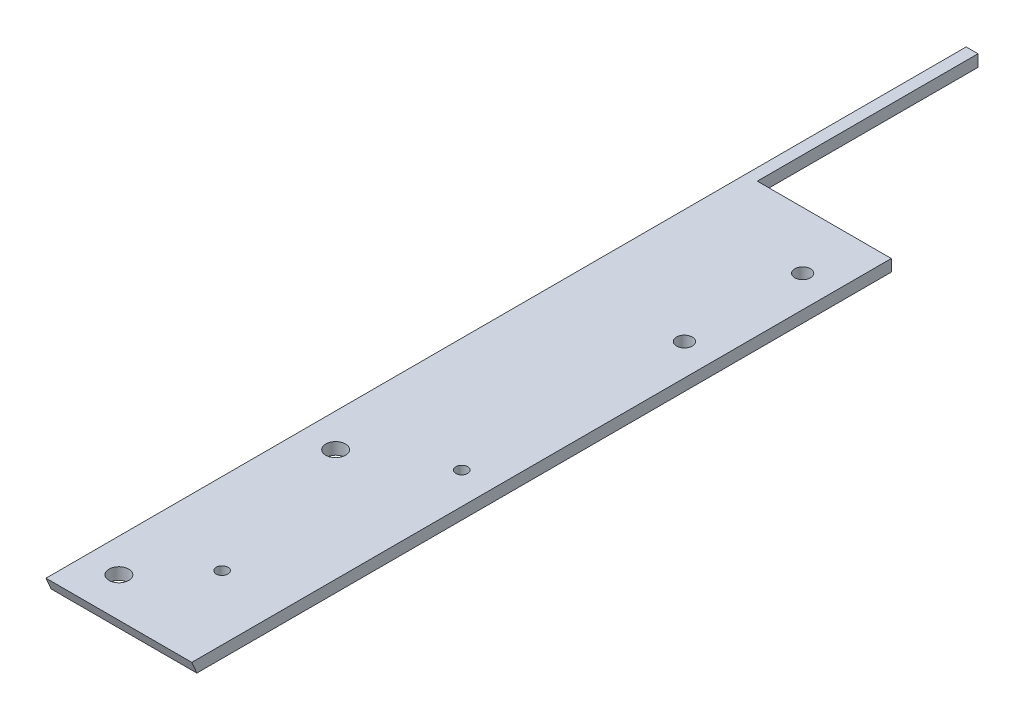
ISO-10303-21;
HEADER;
FILE_DESCRIPTION(('STEP AP214'),'2;1');
FILE_NAME('part.step','',(''),(''),'','','');
FILE_SCHEMA(('AUTOMOTIVE_DESIGN { 1 0 10303 214 1 1 1 1 }'));
ENDSEC;
DATA;
#1=APPLICATION_CONTEXT('core data for automotive mechanical design processes');
#2=APPLICATION_PROTOCOL_DEFINITION('international standard','automotive_design',2000,#1);
#3=PRODUCT_CONTEXT('',#1,'mechanical');
#4=PRODUCT('Part','Part','',(#3));
#5=PRODUCT_RELATED_PRODUCT_CATEGORY('part','',(#4));
#6=PRODUCT_DEFINITION_FORMATION('','',#4);
#7=PRODUCT_DEFINITION_CONTEXT('part definition',#1,'design');
#8=PRODUCT_DEFINITION('design','',#6,#7);
#9=PRODUCT_DEFINITION_SHAPE('','',#8);
#10=(LENGTH_UNIT() NAMED_UNIT(*) SI_UNIT(.MILLI.,.METRE.));
#11=(NAMED_UNIT(*) PLANE_ANGLE_UNIT() SI_UNIT($,.RADIAN.));
#12=(NAMED_UNIT(*) SI_UNIT($,.STERADIAN.) SOLID_ANGLE_UNIT());
#13=UNCERTAINTY_MEASURE_WITH_UNIT(LENGTH_MEASURE(1.E-05),#10,'distance_accuracy_value','');
#14=(GEOMETRIC_REPRESENTATION_CONTEXT(3) GLOBAL_UNCERTAINTY_ASSIGNED_CONTEXT((#13)) GLOBAL_UNIT_ASSIGNED_CONTEXT((#10,
#11,#12)) REPRESENTATION_CONTEXT('',''));
#15=CARTESIAN_POINT('',(0.,0.,0.));
#16=DIRECTION('',(0.,0.,1.));
#17=DIRECTION('',(1.,0.,0.));
#18=AXIS2_PLACEMENT_3D('',#15,#16,#17);
#19=CARTESIAN_POINT('',(0.,6.17328196598963,-150.));
#20=DIRECTION('',(0.,1.,0.));
#21=DIRECTION('',(0.,0.,1.));
#22=AXIS2_PLACEMENT_3D('',#19,#20,#21);
#23=PLANE('',#22);
#24=CARTESIAN_POINT('',(31.9999999999993,6.17328196598963,-25.5));
#25=DIRECTION('',(0.,1.,0.));
#26=DIRECTION('',(0.,0.,1.));
#27=AXIS2_PLACEMENT_3D('',#24,#25,#26);
#28=CIRCLE('',#27,2.);
#29=CARTESIAN_POINT('',(31.9999999999993,6.17328196598963,-23.5));
#30=VERTEX_POINT('',#29);
#31=EDGE_CURVE('E169',#30,#30,#28,.T.);
#32=ORIENTED_EDGE('',*,*,#31,.F.);
#33=EDGE_LOOP('',(#32));
#34=FACE_BOUND('',#33,.T.);
#35=CARTESIAN_POINT('',(31.9999999999991,6.17328196598962,61.0000000000002));
#36=DIRECTION('',(0.,1.,0.));
#37=DIRECTION('',(0.,0.,1.));
#38=AXIS2_PLACEMENT_3D('',#35,#36,#37);
#39=CIRCLE('',#38,1.5);
#40=CARTESIAN_POINT('',(31.9999999999991,6.17328196598962,62.5000000000002));
#41=VERTEX_POINT('',#40);
#42=EDGE_CURVE('E173',#41,#41,#39,.F.);
#43=ORIENTED_EDGE('',*,*,#42,.T.);
#44=EDGE_LOOP('',(#43));
#45=FACE_BOUND('',#44,.T.);
#46=CARTESIAN_POINT('',(23.6907337459031,6.17328196598963,113.5));
#47=DIRECTION('',(0.,1.,0.));
#48=DIRECTION('',(0.,0.,1.));
#49=AXIS2_PLACEMENT_3D('',#46,#47,#48);
#50=CIRCLE('',#49,1.5);
#51=CARTESIAN_POINT('',(23.6907337459031,6.17328196598963,115.));
#52=VERTEX_POINT('',#51);
#53=EDGE_CURVE('E163',#52,#52,#50,.T.);
#54=ORIENTED_EDGE('',*,*,#53,.F.);
#55=EDGE_LOOP('',(#54));
#56=FACE_BOUND('',#55,.T.);
#57=CARTESIAN_POINT('',(31.9999999999993,6.17328196598963,4.49999999999998));
#58=DIRECTION('',(0.,1.,0.));
#59=DIRECTION('',(0.,0.,1.));
#60=AXIS2_PLACEMENT_3D('',#57,#58,#59);
#61=CIRCLE('',#60,2.);
#62=CARTESIAN_POINT('',(31.9999999999993,6.17328196598963,6.49999999999998));
#63=VERTEX_POINT('',#62);
#64=EDGE_CURVE('E160',#63,#63,#61,.T.);
#65=ORIENTED_EDGE('',*,*,#64,.F.);
#66=EDGE_LOOP('',(#65));
#67=FACE_BOUND('',#66,.T.);
#68=CARTESIAN_POINT('',(11.5,6.17328196598963,72.5));
#69=DIRECTION('',(0.,1.,0.));
#70=DIRECTION('',(-1.,0.,0.));
#71=AXIS2_PLACEMENT_3D('',#68,#69,#70);
#72=CIRCLE('',#71,2.5);
#73=CARTESIAN_POINT('',(8.99999999999999,6.17328196598963,72.5));
#74=VERTEX_POINT('',#73);
#75=EDGE_CURVE('E211',#74,#74,#72,.T.);
#76=ORIENTED_EDGE('',*,*,#75,.F.);
#77=EDGE_LOOP('',(#76));
#78=FACE_BOUND('',#77,.T.);
#79=CARTESIAN_POINT('',(11.5,6.17328196598963,127.5));
#80=DIRECTION('',(0.,1.,0.));
#81=DIRECTION('',(-1.,0.,0.));
#82=AXIS2_PLACEMENT_3D('',#79,#80,#81);
#83=CIRCLE('',#82,2.5);
#84=CARTESIAN_POINT('',(9.,6.17328196598963,127.5));
#85=VERTEX_POINT('',#84);
#86=EDGE_CURVE('E208',#85,#85,#83,.T.);
#87=ORIENTED_EDGE('',*,*,#86,.F.);
#88=EDGE_LOOP('',(#87));
#89=FACE_BOUND('',#88,.T.);
#90=DIRECTION('',(1.,0.,0.));
#91=VECTOR('',#90,1.);
#92=CARTESIAN_POINT('',(0.,6.17328196598963,-96.));
#93=LINE('',#92,#91);
#94=CARTESIAN_POINT('',(3.,6.17328196598963,-96.));
#95=VERTEX_POINT('',#94);
#96=CARTESIAN_POINT('',(6.00000000000001,6.17328196598963,-96.));
#97=VERTEX_POINT('',#96);
#98=EDGE_CURVE('E115',#95,#97,#93,.T.);
#99=ORIENTED_EDGE('',*,*,#98,.F.);
#100=DIRECTION('',(0.,0.,-1.));
#101=VECTOR('',#100,1.);
#102=CARTESIAN_POINT('',(3.,6.17328196598963,144.162869871994));
#103=LINE('',#102,#101);
#104=CARTESIAN_POINT('',(3.,6.17328196598963,137.5));
#105=VERTEX_POINT('',#104);
#106=EDGE_CURVE('E73',#105,#95,#103,.T.);
#107=ORIENTED_EDGE('',*,*,#106,.F.);
#108=DIRECTION('',(-1.,0.,0.));
#109=VECTOR('',#108,1.);
#110=CARTESIAN_POINT('',(31.,6.17328196598963,137.5));
#111=LINE('',#110,#109);
#112=CARTESIAN_POINT('',(40.,6.17328196598963,137.5));
#113=VERTEX_POINT('',#112);
#114=EDGE_CURVE('E172',#113,#105,#111,.T.);
#115=ORIENTED_EDGE('',*,*,#114,.F.);
#116=DIRECTION('',(0.,0.,1.));
#117=VECTOR('',#116,1.);
#118=CARTESIAN_POINT('',(40.,6.17328196598963,-150.));
#119=LINE('',#118,#117);
#120=CARTESIAN_POINT('',(40.,6.17328196598963,-40.));
#121=VERTEX_POINT('',#120);
#122=EDGE_CURVE('E181',#121,#113,#119,.T.);
#123=ORIENTED_EDGE('',*,*,#122,.F.);
#124=DIRECTION('',(1.,0.,0.));
#125=VECTOR('',#124,1.);
#126=CARTESIAN_POINT('',(40.,6.17328196598963,-40.));
#127=LINE('',#126,#125);
#128=CARTESIAN_POINT('',(6.00000000000002,6.17328196598963,-40.));
#129=VERTEX_POINT('',#128);
#130=EDGE_CURVE('E146',#129,#121,#127,.T.);
#131=ORIENTED_EDGE('',*,*,#130,.F.);
#132=DIRECTION('',(0.,0.,1.));
#133=VECTOR('',#132,1.);
#134=CARTESIAN_POINT('',(6.00000000000001,6.17328196598963,-150.));
#135=LINE('',#134,#133);
#136=EDGE_CURVE('E145',#97,#129,#135,.T.);
#137=ORIENTED_EDGE('',*,*,#136,.F.);
#138=EDGE_LOOP('',(#99,#107,#115,#123,#131,#137));
#139=FACE_BOUND('',#138,.T.);
#140=ADVANCED_FACE('F69',(#34,#45,#56,#67,#78,#89,#139),#23,.T.);
#141=CARTESIAN_POINT('',(31.,6.17328196598963,137.5));
#142=DIRECTION('',(0.,0.391916943435059,-0.920000602960955));
#143=DIRECTION('',(0.,0.920000602960955,0.391916943435059));
#144=AXIS2_PLACEMENT_3D('',#141,#142,#143);
#145=PLANE('',#144);
#146=DIRECTION('',(0.,0.920000602960955,0.391916943435059));
#147=VECTOR('',#146,1.);
#148=CARTESIAN_POINT('',(3.,6.17328196598962,137.5));
#149=LINE('',#148,#147);
#150=CARTESIAN_POINT('',(3.,3.17328196598962,136.222010804644));
#151=VERTEX_POINT('',#150);
#152=EDGE_CURVE('E103',#151,#105,#149,.T.);
#153=ORIENTED_EDGE('',*,*,#152,.F.);
#154=DIRECTION('',(1.,0.,0.));
#155=VECTOR('',#154,1.);
#156=CARTESIAN_POINT('',(5.00000000000003,3.17328196598962,136.222010804644));
#157=LINE('',#156,#155);
#158=CARTESIAN_POINT('',(40.,3.17328196598962,136.222010804644));
#159=VERTEX_POINT('',#158);
#160=EDGE_CURVE('E170',#151,#159,#157,.T.);
#161=ORIENTED_EDGE('',*,*,#160,.T.);
#162=DIRECTION('',(0.,-0.920000602960956,-0.391916943435057));
#163=VECTOR('',#162,1.);
#164=CARTESIAN_POINT('',(40.,-105.95282860637,89.7346807237414));
#165=LINE('',#164,#163);
#166=EDGE_CURVE('E177',#113,#159,#165,.T.);
#167=ORIENTED_EDGE('',*,*,#166,.F.);
#168=ORIENTED_EDGE('',*,*,#114,.T.);
#169=EDGE_LOOP('',(#153,#161,#167,#168));
#170=FACE_BOUND('',#169,.T.);
#171=ADVANCED_FACE('F195',(#170),#145,.F.);
#172=CARTESIAN_POINT('',(5.00000000000002,3.17328196598962,-150.));
#173=DIRECTION('',(0.,-1.,0.));
#174=DIRECTION('',(1.,0.,0.));
#175=AXIS2_PLACEMENT_3D('',#172,#173,#174);
#176=PLANE('',#175);
#177=CARTESIAN_POINT('',(31.9999999999993,3.17328196598963,-25.5));
#178=DIRECTION('',(0.,-1.,0.));
#179=DIRECTION('',(1.,0.,0.));
#180=AXIS2_PLACEMENT_3D('',#177,#178,#179);
#181=CIRCLE('',#180,2.);
#182=CARTESIAN_POINT('',(33.9999999999994,3.17328196598963,-25.5));
#183=VERTEX_POINT('',#182);
#184=EDGE_CURVE('E186',#183,#183,#181,.T.);
#185=ORIENTED_EDGE('',*,*,#184,.F.);
#186=EDGE_LOOP('',(#185));
#187=FACE_BOUND('',#186,.T.);
#188=CARTESIAN_POINT('',(31.9999999999991,3.17328196598962,61.0000000000002));
#189=DIRECTION('',(0.,-1.,0.));
#190=DIRECTION('',(1.,0.,0.));
#191=AXIS2_PLACEMENT_3D('',#188,#189,#190);
#192=CIRCLE('',#191,1.5);
#193=CARTESIAN_POINT('',(33.4999999999991,3.17328196598962,61.0000000000002));
#194=VERTEX_POINT('',#193);
#195=EDGE_CURVE('E176',#194,#194,#192,.F.);
#196=ORIENTED_EDGE('',*,*,#195,.T.);
#197=EDGE_LOOP('',(#196));
#198=FACE_BOUND('',#197,.T.);
#199=DIRECTION('',(0.,0.,-1.));
#200=VECTOR('',#199,1.);
#201=CARTESIAN_POINT('',(40.,3.17328196598963,-150.));
#202=LINE('',#201,#200);
#203=CARTESIAN_POINT('',(40.,3.17328196598963,-40.));
#204=VERTEX_POINT('',#203);
#205=EDGE_CURVE('E180',#159,#204,#202,.T.);
#206=ORIENTED_EDGE('',*,*,#205,.F.);
#207=ORIENTED_EDGE('',*,*,#160,.F.);
#208=DIRECTION('',(0.,0.,1.));
#209=VECTOR('',#208,1.);
#210=CARTESIAN_POINT('',(3.,3.17328196598962,-150.));
#211=LINE('',#210,#209);
#212=CARTESIAN_POINT('',(3.,3.17328196598962,-96.));
#213=VERTEX_POINT('',#212);
#214=EDGE_CURVE('E12',#213,#151,#211,.T.);
#215=ORIENTED_EDGE('',*,*,#214,.F.);
#216=DIRECTION('',(-1.,0.,0.));
#217=VECTOR('',#216,1.);
#218=CARTESIAN_POINT('',(7.2,3.17328196598962,-96.));
#219=LINE('',#218,#217);
#220=CARTESIAN_POINT('',(6.00000000000001,3.17328196598962,-96.));
#221=VERTEX_POINT('',#220);
#222=EDGE_CURVE('E150',#221,#213,#219,.T.);
#223=ORIENTED_EDGE('',*,*,#222,.F.);
#224=DIRECTION('',(0.,0.,-1.));
#225=VECTOR('',#224,1.);
#226=CARTESIAN_POINT('',(6.00000000000001,3.17328196598962,-150.));
#227=LINE('',#226,#225);
#228=CARTESIAN_POINT('',(6.00000000000002,3.17328196598962,-40.));
#229=VERTEX_POINT('',#228);
#230=EDGE_CURVE('E143',#229,#221,#227,.T.);
#231=ORIENTED_EDGE('',*,*,#230,.F.);
#232=DIRECTION('',(-1.,0.,0.));
#233=VECTOR('',#232,1.);
#234=CARTESIAN_POINT('',(5.00000000000004,3.17328196598962,-40.));
#235=LINE('',#234,#233);
#236=EDGE_CURVE('E129',#204,#229,#235,.T.);
#237=ORIENTED_EDGE('',*,*,#236,.F.);
#238=EDGE_LOOP('',(#206,#207,#215,#223,#231,#237));
#239=FACE_BOUND('',#238,.T.);
#240=CARTESIAN_POINT('',(23.6907337459031,3.17328196598963,113.5));
#241=DIRECTION('',(0.,-1.,0.));
#242=DIRECTION('',(1.,0.,0.));
#243=AXIS2_PLACEMENT_3D('',#240,#241,#242);
#244=CIRCLE('',#243,1.5);
#245=CARTESIAN_POINT('',(25.1907337459031,3.17328196598963,113.5));
#246=VERTEX_POINT('',#245);
#247=EDGE_CURVE('E166',#246,#246,#244,.T.);
#248=ORIENTED_EDGE('',*,*,#247,.F.);
#249=EDGE_LOOP('',(#248));
#250=FACE_BOUND('',#249,.T.);
#251=CARTESIAN_POINT('',(31.9999999999993,3.17328196598962,4.49999999999998));
#252=DIRECTION('',(0.,-1.,0.));
#253=DIRECTION('',(1.,0.,0.));
#254=AXIS2_PLACEMENT_3D('',#251,#252,#253);
#255=CIRCLE('',#254,2.);
#256=CARTESIAN_POINT('',(33.9999999999994,3.17328196598962,4.49999999999998));
#257=VERTEX_POINT('',#256);
#258=EDGE_CURVE('E156',#257,#257,#255,.T.);
#259=ORIENTED_EDGE('',*,*,#258,.F.);
#260=EDGE_LOOP('',(#259));
#261=FACE_BOUND('',#260,.T.);
#262=CARTESIAN_POINT('',(11.5,3.17328196598963,72.5));
#263=DIRECTION('',(0.,1.,0.));
#264=DIRECTION('',(-1.,0.,0.));
#265=AXIS2_PLACEMENT_3D('',#262,#263,#264);
#266=CIRCLE('',#265,2.5);
#267=CARTESIAN_POINT('',(8.99999999999999,3.17328196598963,72.5));
#268=VERTEX_POINT('',#267);
#269=EDGE_CURVE('E199',#268,#268,#266,.T.);
#270=ORIENTED_EDGE('',*,*,#269,.T.);
#271=EDGE_LOOP('',(#270));
#272=FACE_BOUND('',#271,.T.);
#273=CARTESIAN_POINT('',(11.5,3.17328196598963,127.5));
#274=DIRECTION('',(0.,1.,0.));
#275=DIRECTION('',(-1.,0.,0.));
#276=AXIS2_PLACEMENT_3D('',#273,#274,#275);
#277=CIRCLE('',#276,2.5);
#278=CARTESIAN_POINT('',(9.,3.17328196598963,127.5));
#279=VERTEX_POINT('',#278);
#280=EDGE_CURVE('E202',#279,#279,#277,.T.);
#281=ORIENTED_EDGE('',*,*,#280,.T.);
#282=EDGE_LOOP('',(#281));
#283=FACE_BOUND('',#282,.T.);
#284=ADVANCED_FACE('F148',(#187,#198,#239,#250,#261,#272,#283),#176,.T.);
#285=CARTESIAN_POINT('',(11.5,3.17328196598963,127.5));
#286=DIRECTION('',(0.,1.,0.));
#287=DIRECTION('',(-1.,0.,0.));
#288=AXIS2_PLACEMENT_3D('',#285,#286,#287);
#289=CYLINDRICAL_SURFACE('',#288,2.5);
#290=ORIENTED_EDGE('',*,*,#280,.F.);
#291=EDGE_LOOP('',(#290));
#292=FACE_BOUND('',#291,.T.);
#293=ORIENTED_EDGE('',*,*,#86,.T.);
#294=EDGE_LOOP('',(#293));
#295=FACE_BOUND('',#294,.T.);
#296=ADVANCED_FACE('F194',(#292,#295),#289,.F.);
#297=CARTESIAN_POINT('',(11.5,3.17328196598963,72.5));
#298=DIRECTION('',(0.,1.,0.));
#299=DIRECTION('',(-1.,0.,0.));
#300=AXIS2_PLACEMENT_3D('',#297,#298,#299);
#301=CYLINDRICAL_SURFACE('',#300,2.5);
#302=ORIENTED_EDGE('',*,*,#269,.F.);
#303=EDGE_LOOP('',(#302));
#304=FACE_BOUND('',#303,.T.);
#305=ORIENTED_EDGE('',*,*,#75,.T.);
#306=EDGE_LOOP('',(#305));
#307=FACE_BOUND('',#306,.T.);
#308=ADVANCED_FACE('F255',(#304,#307),#301,.F.);
#309=CARTESIAN_POINT('',(40.,-3.82671803401037,-150.));
#310=DIRECTION('',(-1.,0.,0.));
#311=DIRECTION('',(0.,-1.,0.));
#312=AXIS2_PLACEMENT_3D('',#309,#310,#311);
#313=PLANE('',#312);
#314=ORIENTED_EDGE('',*,*,#122,.T.);
#315=ORIENTED_EDGE('',*,*,#166,.T.);
#316=ORIENTED_EDGE('',*,*,#205,.T.);
#317=DIRECTION('',(0.,1.,0.));
#318=VECTOR('',#317,1.);
#319=CARTESIAN_POINT('',(40.,-3.82671803401037,-40.));
#320=LINE('',#319,#318);
#321=EDGE_CURVE('E135',#204,#121,#320,.T.);
#322=ORIENTED_EDGE('',*,*,#321,.T.);
#323=EDGE_LOOP('',(#314,#315,#316,#322));
#324=FACE_BOUND('',#323,.T.);
#325=ADVANCED_FACE('F220',(#324),#313,.F.);
#326=CARTESIAN_POINT('',(40.,2.17328196598963,-40.));
#327=DIRECTION('',(0.,0.,1.));
#328=DIRECTION('',(1.,0.,0.));
#329=AXIS2_PLACEMENT_3D('',#326,#327,#328);
#330=PLANE('',#329);
#331=ORIENTED_EDGE('',*,*,#236,.T.);
#332=DIRECTION('',(0.,1.,0.));
#333=VECTOR('',#332,1.);
#334=CARTESIAN_POINT('',(6.00000000000002,2.17328196598963,-40.));
#335=LINE('',#334,#333);
#336=EDGE_CURVE('E132',#229,#129,#335,.T.);
#337=ORIENTED_EDGE('',*,*,#336,.T.);
#338=ORIENTED_EDGE('',*,*,#130,.T.);
#339=ORIENTED_EDGE('',*,*,#321,.F.);
#340=EDGE_LOOP('',(#331,#337,#338,#339));
#341=FACE_BOUND('',#340,.T.);
#342=ADVANCED_FACE('F131',(#341),#330,.F.);
#343=CARTESIAN_POINT('',(6.00000000000001,2.17328196598963,-150.));
#344=DIRECTION('',(-1.,0.,0.));
#345=DIRECTION('',(0.,-1.,0.));
#346=AXIS2_PLACEMENT_3D('',#343,#344,#345);
#347=PLANE('',#346);
#348=ORIENTED_EDGE('',*,*,#230,.T.);
#349=DIRECTION('',(0.,1.,0.));
#350=VECTOR('',#349,1.);
#351=CARTESIAN_POINT('',(6.00000000000001,2.17328196598963,-96.));
#352=LINE('',#351,#350);
#353=EDGE_CURVE('E110',#221,#97,#352,.T.);
#354=ORIENTED_EDGE('',*,*,#353,.T.);
#355=ORIENTED_EDGE('',*,*,#136,.T.);
#356=ORIENTED_EDGE('',*,*,#336,.F.);
#357=EDGE_LOOP('',(#348,#354,#355,#356));
#358=FACE_BOUND('',#357,.T.);
#359=ADVANCED_FACE('F142',(#358),#347,.F.);
#360=CARTESIAN_POINT('',(7.2,13.1732819659896,-96.));
#361=DIRECTION('',(0.,0.,1.));
#362=DIRECTION('',(1.,0.,0.));
#363=AXIS2_PLACEMENT_3D('',#360,#361,#362);
#364=PLANE('',#363);
#365=ORIENTED_EDGE('',*,*,#98,.T.);
#366=ORIENTED_EDGE('',*,*,#353,.F.);
#367=ORIENTED_EDGE('',*,*,#222,.T.);
#368=DIRECTION('',(0.,-1.,0.));
#369=VECTOR('',#368,1.);
#370=CARTESIAN_POINT('',(3.,13.1732819659896,-96.));
#371=LINE('',#370,#369);
#372=EDGE_CURVE('E79',#95,#213,#371,.T.);
#373=ORIENTED_EDGE('',*,*,#372,.F.);
#374=EDGE_LOOP('',(#365,#366,#367,#373));
#375=FACE_BOUND('',#374,.T.);
#376=ADVANCED_FACE('F244',(#375),#364,.F.);
#377=CARTESIAN_POINT('',(31.9999999999993,-19.8267180340104,4.49999999999998));
#378=DIRECTION('',(0.,1.,0.));
#379=DIRECTION('',(0.,0.,1.));
#380=AXIS2_PLACEMENT_3D('',#377,#378,#379);
#381=CYLINDRICAL_SURFACE('',#380,2.);
#382=ORIENTED_EDGE('',*,*,#258,.T.);
#383=EDGE_LOOP('',(#382));
#384=FACE_BOUND('',#383,.T.);
#385=ORIENTED_EDGE('',*,*,#64,.T.);
#386=EDGE_LOOP('',(#385));
#387=FACE_BOUND('',#386,.T.);
#388=ADVANCED_FACE('F249',(#384,#387),#381,.F.);
#389=CARTESIAN_POINT('',(23.6907337459031,13.1732819659896,113.5));
#390=DIRECTION('',(0.,-1.,0.));
#391=DIRECTION('',(1.,0.,0.));
#392=AXIS2_PLACEMENT_3D('',#389,#390,#391);
#393=CYLINDRICAL_SURFACE('',#392,1.5);
#394=ORIENTED_EDGE('',*,*,#53,.T.);
#395=EDGE_LOOP('',(#394));
#396=FACE_BOUND('',#395,.T.);
#397=ORIENTED_EDGE('',*,*,#247,.T.);
#398=EDGE_LOOP('',(#397));
#399=FACE_BOUND('',#398,.T.);
#400=ADVANCED_FACE('F234',(#396,#399),#393,.F.);
#401=CARTESIAN_POINT('',(31.9999999999991,19.1732819659896,61.0000000000002));
#402=DIRECTION('',(0.,-1.,0.));
#403=DIRECTION('',(0.,0.,-1.));
#404=AXIS2_PLACEMENT_3D('',#401,#402,#403);
#405=CYLINDRICAL_SURFACE('',#404,1.5);
#406=ORIENTED_EDGE('',*,*,#42,.F.);
#407=EDGE_LOOP('',(#406));
#408=FACE_BOUND('',#407,.T.);
#409=ORIENTED_EDGE('',*,*,#195,.F.);
#410=EDGE_LOOP('',(#409));
#411=FACE_BOUND('',#410,.T.);
#412=ADVANCED_FACE('F236',(#408,#411),#405,.F.);
#413=CARTESIAN_POINT('',(31.9999999999993,13.1732819659896,-25.5));
#414=DIRECTION('',(0.,-1.,0.));
#415=DIRECTION('',(1.,0.,0.));
#416=AXIS2_PLACEMENT_3D('',#413,#414,#415);
#417=CYLINDRICAL_SURFACE('',#416,2.);
#418=ORIENTED_EDGE('',*,*,#31,.T.);
#419=EDGE_LOOP('',(#418));
#420=FACE_BOUND('',#419,.T.);
#421=ORIENTED_EDGE('',*,*,#184,.T.);
#422=EDGE_LOOP('',(#421));
#423=FACE_BOUND('',#422,.T.);
#424=ADVANCED_FACE('F190',(#420,#423),#417,.F.);
#425=CARTESIAN_POINT('',(3.,0.,0.));
#426=DIRECTION('',(-1.,0.,0.));
#427=DIRECTION('',(0.,-1.,0.));
#428=AXIS2_PLACEMENT_3D('',#425,#426,#427);
#429=PLANE('',#428);
#430=ORIENTED_EDGE('',*,*,#152,.T.);
#431=ORIENTED_EDGE('',*,*,#106,.T.);
#432=ORIENTED_EDGE('',*,*,#372,.T.);
#433=ORIENTED_EDGE('',*,*,#214,.T.);
#434=EDGE_LOOP('',(#430,#431,#432,#433));
#435=FACE_BOUND('',#434,.T.);
#436=ADVANCED_FACE('F71',(#435),#429,.T.);
#437=CLOSED_SHELL('',(#140,#171,#284,#296,#308,#325,#342,#359,#376,#388,#400,#412,#424,#436));
#438=MANIFOLD_SOLID_BREP('B2',#437);
#439=ADVANCED_BREP_SHAPE_REPRESENTATION('',(#18,#438),#14);
#440=SHAPE_DEFINITION_REPRESENTATION(#9,#439);
ENDSEC;
END-ISO-10303-21;
